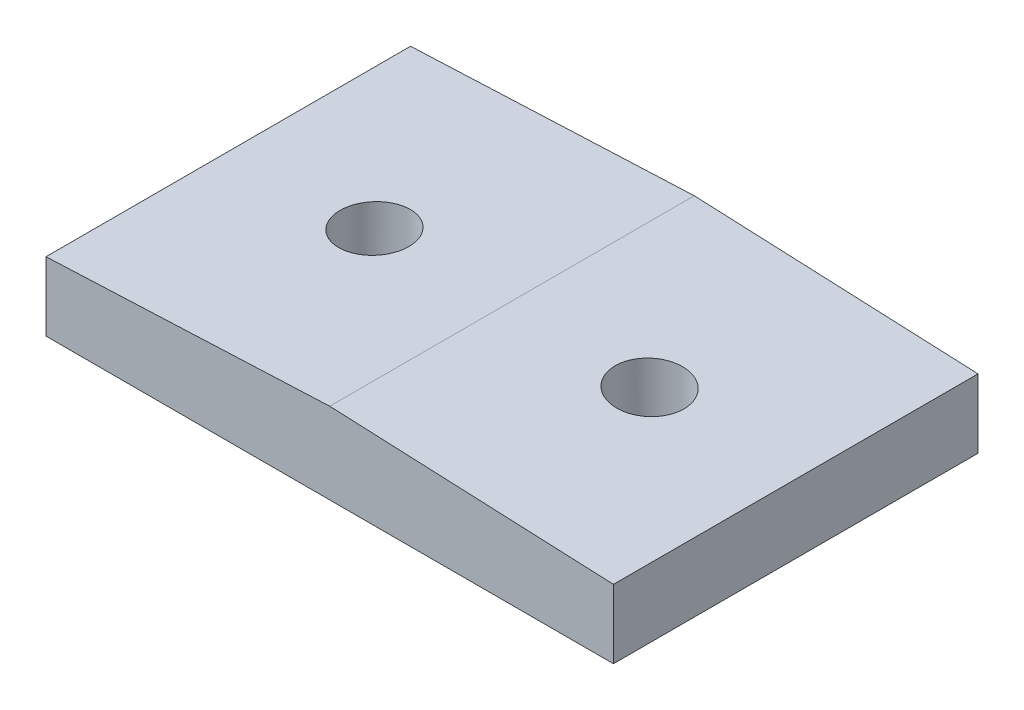
ISO-10303-21;
HEADER;
FILE_DESCRIPTION(('STEP AP214'),'2;1');
FILE_NAME('part.step','',(''),(''),'','','');
FILE_SCHEMA(('AUTOMOTIVE_DESIGN { 1 0 10303 214 1 1 1 1 }'));
ENDSEC;
DATA;
#1=APPLICATION_CONTEXT('core data for automotive mechanical design processes');
#2=APPLICATION_PROTOCOL_DEFINITION('international standard','automotive_design',2000,#1);
#3=PRODUCT_CONTEXT('',#1,'mechanical');
#4=PRODUCT('Part','Part','',(#3));
#5=PRODUCT_RELATED_PRODUCT_CATEGORY('part','',(#4));
#6=PRODUCT_DEFINITION_FORMATION('','',#4);
#7=PRODUCT_DEFINITION_CONTEXT('part definition',#1,'design');
#8=PRODUCT_DEFINITION('design','',#6,#7);
#9=PRODUCT_DEFINITION_SHAPE('','',#8);
#10=(LENGTH_UNIT() NAMED_UNIT(*) SI_UNIT(.MILLI.,.METRE.));
#11=(NAMED_UNIT(*) PLANE_ANGLE_UNIT() SI_UNIT($,.RADIAN.));
#12=(NAMED_UNIT(*) SI_UNIT($,.STERADIAN.) SOLID_ANGLE_UNIT());
#13=UNCERTAINTY_MEASURE_WITH_UNIT(LENGTH_MEASURE(1.E-05),#10,'distance_accuracy_value','');
#14=(GEOMETRIC_REPRESENTATION_CONTEXT(3) GLOBAL_UNCERTAINTY_ASSIGNED_CONTEXT((#13)) GLOBAL_UNIT_ASSIGNED_CONTEXT((#10,
#11,#12)) REPRESENTATION_CONTEXT('',''));
#15=CARTESIAN_POINT('',(0.,0.,0.));
#16=DIRECTION('',(0.,0.,1.));
#17=DIRECTION('',(1.,0.,0.));
#18=AXIS2_PLACEMENT_3D('',#15,#16,#17);
#19=CARTESIAN_POINT('',(-8.25,2.,10.6));
#20=DIRECTION('',(1.,0.,0.));
#21=DIRECTION('',(0.,0.,-1.));
#22=AXIS2_PLACEMENT_3D('',#19,#20,#21);
#23=PLANE('',#22);
#24=DIRECTION('',(0.,-1.,0.));
#25=VECTOR('',#24,1.);
#26=CARTESIAN_POINT('',(-8.25,2.,0.));
#27=LINE('',#26,#25);
#28=CARTESIAN_POINT('',(-8.25,2.,0.));
#29=VERTEX_POINT('',#28);
#30=CARTESIAN_POINT('',(-8.25,0.,0.));
#31=VERTEX_POINT('',#30);
#32=EDGE_CURVE('E117',#29,#31,#27,.T.);
#33=ORIENTED_EDGE('',*,*,#32,.T.);
#34=DIRECTION('',(0.,0.,-1.));
#35=VECTOR('',#34,1.);
#36=CARTESIAN_POINT('',(-8.25,0.,10.6));
#37=LINE('',#36,#35);
#38=CARTESIAN_POINT('',(-8.25,0.,10.6));
#39=VERTEX_POINT('',#38);
#40=EDGE_CURVE('E11',#39,#31,#37,.T.);
#41=ORIENTED_EDGE('',*,*,#40,.F.);
#42=DIRECTION('',(0.,-1.,0.));
#43=VECTOR('',#42,1.);
#44=CARTESIAN_POINT('',(-8.25,2.,10.6));
#45=LINE('',#44,#43);
#46=CARTESIAN_POINT('',(-8.25,2.,10.6));
#47=VERTEX_POINT('',#46);
#48=EDGE_CURVE('E125',#47,#39,#45,.T.);
#49=ORIENTED_EDGE('',*,*,#48,.F.);
#50=DIRECTION('',(0.,0.,-1.));
#51=VECTOR('',#50,1.);
#52=CARTESIAN_POINT('',(-8.25,2.,10.6));
#53=LINE('',#52,#51);
#54=EDGE_CURVE('E113',#47,#29,#53,.T.);
#55=ORIENTED_EDGE('',*,*,#54,.T.);
#56=EDGE_LOOP('',(#33,#41,#49,#55));
#57=FACE_BOUND('',#56,.T.);
#58=ADVANCED_FACE('F41',(#57),#23,.F.);
#59=CARTESIAN_POINT('',(-8.25,0.,10.6));
#60=DIRECTION('',(0.,1.,0.));
#61=DIRECTION('',(-1.,0.,0.));
#62=AXIS2_PLACEMENT_3D('',#59,#60,#61);
#63=PLANE('',#62);
#64=CARTESIAN_POINT('',(4.,0.,5.3));
#65=DIRECTION('',(0.,-1.,0.));
#66=DIRECTION('',(1.,0.,0.));
#67=AXIS2_PLACEMENT_3D('',#64,#65,#66);
#68=CIRCLE('',#67,1.);
#69=CARTESIAN_POINT('',(5.,0.,5.3));
#70=VERTEX_POINT('',#69);
#71=EDGE_CURVE('E130',#70,#70,#68,.T.);
#72=ORIENTED_EDGE('',*,*,#71,.F.);
#73=EDGE_LOOP('',(#72));
#74=FACE_BOUND('',#73,.T.);
#75=CARTESIAN_POINT('',(-4.,0.,5.3));
#76=DIRECTION('',(0.,-1.,0.));
#77=DIRECTION('',(-1.,0.,0.));
#78=AXIS2_PLACEMENT_3D('',#75,#76,#77);
#79=CIRCLE('',#78,1.);
#80=CARTESIAN_POINT('',(-5.,0.,5.3));
#81=VERTEX_POINT('',#80);
#82=EDGE_CURVE('E135',#81,#81,#79,.T.);
#83=ORIENTED_EDGE('',*,*,#82,.F.);
#84=EDGE_LOOP('',(#83));
#85=FACE_BOUND('',#84,.T.);
#86=DIRECTION('',(1.,0.,0.));
#87=VECTOR('',#86,1.);
#88=CARTESIAN_POINT('',(-8.25,0.,0.));
#89=LINE('',#88,#87);
#90=CARTESIAN_POINT('',(8.25,0.,0.));
#91=VERTEX_POINT('',#90);
#92=EDGE_CURVE('E120',#31,#91,#89,.T.);
#93=ORIENTED_EDGE('',*,*,#92,.T.);
#94=DIRECTION('',(0.,0.,-1.));
#95=VECTOR('',#94,1.);
#96=CARTESIAN_POINT('',(8.25,0.,10.6));
#97=LINE('',#96,#95);
#98=CARTESIAN_POINT('',(8.25,0.,10.6));
#99=VERTEX_POINT('',#98);
#100=EDGE_CURVE('E50',#99,#91,#97,.T.);
#101=ORIENTED_EDGE('',*,*,#100,.F.);
#102=DIRECTION('',(1.,0.,0.));
#103=VECTOR('',#102,1.);
#104=CARTESIAN_POINT('',(-8.25,0.,10.6));
#105=LINE('',#104,#103);
#106=EDGE_CURVE('E93',#39,#99,#105,.T.);
#107=ORIENTED_EDGE('',*,*,#106,.F.);
#108=ORIENTED_EDGE('',*,*,#40,.T.);
#109=EDGE_LOOP('',(#93,#101,#107,#108));
#110=FACE_BOUND('',#109,.T.);
#111=ADVANCED_FACE('F146',(#74,#85,#110),#63,.F.);
#112=CARTESIAN_POINT('',(8.25,0.,10.6));
#113=DIRECTION('',(-1.,0.,0.));
#114=DIRECTION('',(0.,0.,1.));
#115=AXIS2_PLACEMENT_3D('',#112,#113,#114);
#116=PLANE('',#115);
#117=DIRECTION('',(0.,1.,0.));
#118=VECTOR('',#117,1.);
#119=CARTESIAN_POINT('',(8.25,0.,0.));
#120=LINE('',#119,#118);
#121=CARTESIAN_POINT('',(8.25,2.,0.));
#122=VERTEX_POINT('',#121);
#123=EDGE_CURVE('E108',#91,#122,#120,.T.);
#124=ORIENTED_EDGE('',*,*,#123,.T.);
#125=DIRECTION('',(0.,0.,-1.));
#126=VECTOR('',#125,1.);
#127=CARTESIAN_POINT('',(8.25,2.,10.6));
#128=LINE('',#127,#126);
#129=CARTESIAN_POINT('',(8.25,2.,10.6));
#130=VERTEX_POINT('',#129);
#131=EDGE_CURVE('E105',#130,#122,#128,.T.);
#132=ORIENTED_EDGE('',*,*,#131,.F.);
#133=DIRECTION('',(0.,1.,0.));
#134=VECTOR('',#133,1.);
#135=CARTESIAN_POINT('',(8.25,0.,10.6));
#136=LINE('',#135,#134);
#137=EDGE_CURVE('E97',#99,#130,#136,.T.);
#138=ORIENTED_EDGE('',*,*,#137,.F.);
#139=ORIENTED_EDGE('',*,*,#100,.T.);
#140=EDGE_LOOP('',(#124,#132,#138,#139));
#141=FACE_BOUND('',#140,.T.);
#142=ADVANCED_FACE('F106',(#141),#116,.F.);
#143=CARTESIAN_POINT('',(8.25,2.,10.6));
#144=DIRECTION('',(-0.043619387365336,-0.999048221581858,0.));
#145=DIRECTION('',(0.999048221581858,-0.043619387365336,0.));
#146=AXIS2_PLACEMENT_3D('',#143,#144,#145);
#147=PLANE('',#146);
#148=CARTESIAN_POINT('',(4.,2.18555900736118,5.3));
#149=DIRECTION('',(-0.043619387365336,-0.999048221581858,0.));
#150=DIRECTION('',(0.999048221581858,-0.043619387365336,0.));
#151=AXIS2_PLACEMENT_3D('',#148,#149,#150);
#152=ELLIPSE('',#151,1.00095268516332,1.);
#153=CARTESIAN_POINT('',(5.,2.14189806445267,5.3));
#154=VERTEX_POINT('',#153);
#155=EDGE_CURVE('E44',#154,#154,#152,.T.);
#156=ORIENTED_EDGE('',*,*,#155,.T.);
#157=EDGE_LOOP('',(#156));
#158=FACE_BOUND('',#157,.T.);
#159=DIRECTION('',(-0.999048221581858,0.043619387365336,0.));
#160=VECTOR('',#159,1.);
#161=CARTESIAN_POINT('',(8.25,2.,0.));
#162=LINE('',#161,#160);
#163=CARTESIAN_POINT('',(0.,2.36020277899523,0.));
#164=VERTEX_POINT('',#163);
#165=EDGE_CURVE('E79',#122,#164,#162,.T.);
#166=ORIENTED_EDGE('',*,*,#165,.T.);
#167=DIRECTION('',(0.,0.,-1.));
#168=VECTOR('',#167,1.);
#169=CARTESIAN_POINT('',(0.,2.36020277899523,10.6));
#170=LINE('',#169,#168);
#171=CARTESIAN_POINT('',(0.,2.36020277899523,10.6));
#172=VERTEX_POINT('',#171);
#173=EDGE_CURVE('E109',#172,#164,#170,.T.);
#174=ORIENTED_EDGE('',*,*,#173,.F.);
#175=DIRECTION('',(-0.999048221581858,0.043619387365336,0.));
#176=VECTOR('',#175,1.);
#177=CARTESIAN_POINT('',(8.25,2.,10.6));
#178=LINE('',#177,#176);
#179=EDGE_CURVE('E101',#130,#172,#178,.T.);
#180=ORIENTED_EDGE('',*,*,#179,.F.);
#181=ORIENTED_EDGE('',*,*,#131,.T.);
#182=EDGE_LOOP('',(#166,#174,#180,#181));
#183=FACE_BOUND('',#182,.T.);
#184=ADVANCED_FACE('F111',(#158,#183),#147,.F.);
#185=CARTESIAN_POINT('',(0.,2.36020277899523,10.6));
#186=DIRECTION('',(0.0436193873653363,-0.999048221581858,0.));
#187=DIRECTION('',(0.999048221581858,0.0436193873653363,0.));
#188=AXIS2_PLACEMENT_3D('',#185,#186,#187);
#189=PLANE('',#188);
#190=CARTESIAN_POINT('',(-4.,2.18555900736118,5.3));
#191=DIRECTION('',(0.0436193873653363,-0.999048221581858,0.));
#192=DIRECTION('',(-0.999048221581858,-0.0436193873653363,0.));
#193=AXIS2_PLACEMENT_3D('',#190,#191,#192);
#194=ELLIPSE('',#193,1.00095268516332,1.);
#195=CARTESIAN_POINT('',(-5.,2.14189806445267,5.3));
#196=VERTEX_POINT('',#195);
#197=EDGE_CURVE('E128',#196,#196,#194,.T.);
#198=ORIENTED_EDGE('',*,*,#197,.T.);
#199=EDGE_LOOP('',(#198));
#200=FACE_BOUND('',#199,.T.);
#201=DIRECTION('',(-0.999048221581858,-0.0436193873653363,0.));
#202=VECTOR('',#201,1.);
#203=CARTESIAN_POINT('',(0.,2.36020277899523,0.));
#204=LINE('',#203,#202);
#205=EDGE_CURVE('E85',#164,#29,#204,.T.);
#206=ORIENTED_EDGE('',*,*,#205,.T.);
#207=ORIENTED_EDGE('',*,*,#54,.F.);
#208=DIRECTION('',(-0.999048221581858,-0.0436193873653363,0.));
#209=VECTOR('',#208,1.);
#210=CARTESIAN_POINT('',(0.,2.36020277899523,10.6));
#211=LINE('',#210,#209);
#212=EDGE_CURVE('E59',#172,#47,#211,.T.);
#213=ORIENTED_EDGE('',*,*,#212,.F.);
#214=ORIENTED_EDGE('',*,*,#173,.T.);
#215=EDGE_LOOP('',(#206,#207,#213,#214));
#216=FACE_BOUND('',#215,.T.);
#217=ADVANCED_FACE('F160',(#200,#216),#189,.F.);
#218=CARTESIAN_POINT('',(0.,0.,10.6));
#219=DIRECTION('',(0.,0.,1.));
#220=DIRECTION('',(1.,0.,0.));
#221=AXIS2_PLACEMENT_3D('',#218,#219,#220);
#222=PLANE('',#221);
#223=ORIENTED_EDGE('',*,*,#48,.T.);
#224=ORIENTED_EDGE('',*,*,#106,.T.);
#225=ORIENTED_EDGE('',*,*,#137,.T.);
#226=ORIENTED_EDGE('',*,*,#179,.T.);
#227=ORIENTED_EDGE('',*,*,#212,.T.);
#228=EDGE_LOOP('',(#223,#224,#225,#226,#227));
#229=FACE_BOUND('',#228,.T.);
#230=ADVANCED_FACE('F99',(#229),#222,.T.);
#231=CARTESIAN_POINT('',(0.,0.,0.));
#232=DIRECTION('',(0.,0.,1.));
#233=DIRECTION('',(1.,0.,0.));
#234=AXIS2_PLACEMENT_3D('',#231,#232,#233);
#235=PLANE('',#234);
#236=ORIENTED_EDGE('',*,*,#32,.F.);
#237=ORIENTED_EDGE('',*,*,#205,.F.);
#238=ORIENTED_EDGE('',*,*,#165,.F.);
#239=ORIENTED_EDGE('',*,*,#123,.F.);
#240=ORIENTED_EDGE('',*,*,#92,.F.);
#241=EDGE_LOOP('',(#236,#237,#238,#239,#240));
#242=FACE_BOUND('',#241,.T.);
#243=ADVANCED_FACE('F148',(#242),#235,.F.);
#244=CARTESIAN_POINT('',(-4.,2.36020277899523,5.3));
#245=DIRECTION('',(0.,-1.,0.));
#246=DIRECTION('',(1.,0.,0.));
#247=AXIS2_PLACEMENT_3D('',#244,#245,#246);
#248=CYLINDRICAL_SURFACE('',#247,1.);
#249=ORIENTED_EDGE('',*,*,#82,.T.);
#250=EDGE_LOOP('',(#249));
#251=FACE_BOUND('',#250,.T.);
#252=ORIENTED_EDGE('',*,*,#197,.F.);
#253=EDGE_LOOP('',(#252));
#254=FACE_BOUND('',#253,.T.);
#255=ADVANCED_FACE('F150',(#251,#254),#248,.F.);
#256=CARTESIAN_POINT('',(4.,2.36020277899523,5.3));
#257=DIRECTION('',(0.,-1.,0.));
#258=DIRECTION('',(1.,0.,0.));
#259=AXIS2_PLACEMENT_3D('',#256,#257,#258);
#260=CYLINDRICAL_SURFACE('',#259,1.);
#261=ORIENTED_EDGE('',*,*,#71,.T.);
#262=EDGE_LOOP('',(#261));
#263=FACE_BOUND('',#262,.T.);
#264=ORIENTED_EDGE('',*,*,#155,.F.);
#265=EDGE_LOOP('',(#264));
#266=FACE_BOUND('',#265,.T.);
#267=ADVANCED_FACE('F157',(#263,#266),#260,.F.);
#268=CLOSED_SHELL('',(#58,#111,#142,#184,#217,#230,#243,#255,#267));
#269=MANIFOLD_SOLID_BREP('B2',#268);
#270=ADVANCED_BREP_SHAPE_REPRESENTATION('',(#18,#269),#14);
#271=SHAPE_DEFINITION_REPRESENTATION(#9,#270);
ENDSEC;
END-ISO-10303-21;
